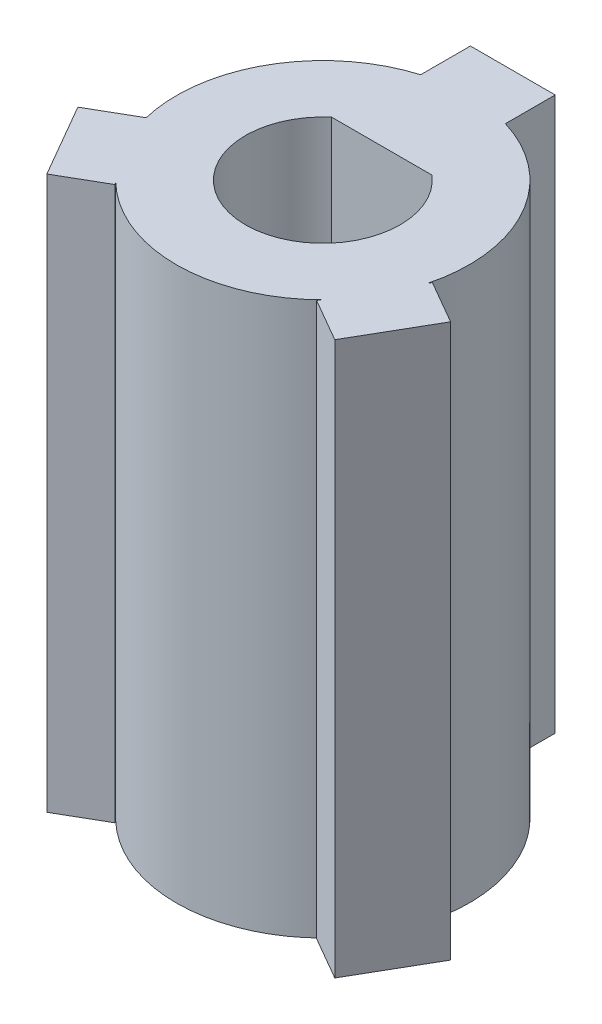
ISO-10303-21;
HEADER;
FILE_DESCRIPTION(('STEP AP214'),'2;1');
FILE_NAME('part.step','',(''),(''),'','','');
FILE_SCHEMA(('AUTOMOTIVE_DESIGN { 1 0 10303 214 1 1 1 1 }'));
ENDSEC;
DATA;
#1=APPLICATION_CONTEXT('core data for automotive mechanical design processes');
#2=APPLICATION_PROTOCOL_DEFINITION('international standard','automotive_design',2000,#1);
#3=PRODUCT_CONTEXT('',#1,'mechanical');
#4=PRODUCT('Part','Part','',(#3));
#5=PRODUCT_RELATED_PRODUCT_CATEGORY('part','',(#4));
#6=PRODUCT_DEFINITION_FORMATION('','',#4);
#7=PRODUCT_DEFINITION_CONTEXT('part definition',#1,'design');
#8=PRODUCT_DEFINITION('design','',#6,#7);
#9=PRODUCT_DEFINITION_SHAPE('','',#8);
#10=(LENGTH_UNIT() NAMED_UNIT(*) SI_UNIT(.MILLI.,.METRE.));
#11=(NAMED_UNIT(*) PLANE_ANGLE_UNIT() SI_UNIT($,.RADIAN.));
#12=(NAMED_UNIT(*) SI_UNIT($,.STERADIAN.) SOLID_ANGLE_UNIT());
#13=UNCERTAINTY_MEASURE_WITH_UNIT(LENGTH_MEASURE(1.E-05),#10,'distance_accuracy_value','');
#14=(GEOMETRIC_REPRESENTATION_CONTEXT(3) GLOBAL_UNCERTAINTY_ASSIGNED_CONTEXT((#13)) GLOBAL_UNIT_ASSIGNED_CONTEXT((#10,
#11,#12)) REPRESENTATION_CONTEXT('',''));
#15=CARTESIAN_POINT('',(0.,0.,0.));
#16=DIRECTION('',(0.,0.,1.));
#17=DIRECTION('',(1.,0.,0.));
#18=AXIS2_PLACEMENT_3D('',#15,#16,#17);
#19=CARTESIAN_POINT('',(0.,15.,0.));
#20=DIRECTION('',(0.,-1.,0.));
#21=DIRECTION('',(0.,0.,-1.));
#22=AXIS2_PLACEMENT_3D('',#19,#20,#21);
#23=CYLINDRICAL_SURFACE('',#22,3.975);
#24=CARTESIAN_POINT('',(0.,15.,0.));
#25=DIRECTION('',(0.,1.,0.));
#26=DIRECTION('',(0.,0.,1.));
#27=AXIS2_PLACEMENT_3D('',#24,#25,#26);
#28=CIRCLE('',#27,3.975);
#29=CARTESIAN_POINT('',(-2.75382417152025,15.,2.86654451079183));
#30=VERTEX_POINT('',#29);
#31=CARTESIAN_POINT('',(2.78842197507801,15.,2.8329009670128));
#32=VERTEX_POINT('',#31);
#33=EDGE_CURVE('E49',#30,#32,#28,.T.);
#34=ORIENTED_EDGE('',*,*,#33,.F.);
#35=DIRECTION('',(0.,-1.,0.));
#36=VECTOR('',#35,1.);
#37=CARTESIAN_POINT('',(-2.75382417152025,15.,2.86654451079183));
#38=LINE('',#37,#36);
#39=CARTESIAN_POINT('',(-2.75382417152025,0.,2.86654451079183));
#40=VERTEX_POINT('',#39);
#41=EDGE_CURVE('E219',#30,#40,#38,.T.);
#42=ORIENTED_EDGE('',*,*,#41,.T.);
#43=CARTESIAN_POINT('',(0.,0.,0.));
#44=DIRECTION('',(0.,1.,0.));
#45=DIRECTION('',(0.,0.,1.));
#46=AXIS2_PLACEMENT_3D('',#43,#44,#45);
#47=CIRCLE('',#46,3.975);
#48=CARTESIAN_POINT('',(2.78842197507801,0.,2.8329009670128));
#49=VERTEX_POINT('',#48);
#50=EDGE_CURVE('E342',#40,#49,#47,.T.);
#51=ORIENTED_EDGE('',*,*,#50,.T.);
#52=DIRECTION('',(0.,-1.,0.));
#53=VECTOR('',#52,1.);
#54=CARTESIAN_POINT('',(2.78842197507801,15.,2.8329009670128));
#55=LINE('',#54,#53);
#56=EDGE_CURVE('E266',#49,#32,#55,.F.);
#57=ORIENTED_EDGE('',*,*,#56,.T.);
#58=EDGE_LOOP('',(#34,#42,#51,#57));
#59=FACE_BOUND('',#58,.T.);
#60=ADVANCED_FACE('F39',(#59),#23,.T.);
#61=CARTESIAN_POINT('',(3.84757519137759,15.,0.998393783381934));
#62=VERTEX_POINT('',#61);
#63=CARTESIAN_POINT('',(1.15,15.,-3.80501314058178));
#64=VERTEX_POINT('',#63);
#65=EDGE_CURVE('E50',#62,#64,#28,.T.);
#66=ORIENTED_EDGE('',*,*,#65,.F.);
#67=DIRECTION('',(0.,-1.,0.));
#68=VECTOR('',#67,1.);
#69=CARTESIAN_POINT('',(3.84757519137759,15.,0.998393783381935));
#70=LINE('',#69,#68);
#71=CARTESIAN_POINT('',(3.84757519137759,0.,0.998393783381934));
#72=VERTEX_POINT('',#71);
#73=EDGE_CURVE('E269',#62,#72,#70,.T.);
#74=ORIENTED_EDGE('',*,*,#73,.T.);
#75=CARTESIAN_POINT('',(1.15,0.,-3.80501314058178));
#76=VERTEX_POINT('',#75);
#77=EDGE_CURVE('E327',#72,#76,#47,.T.);
#78=ORIENTED_EDGE('',*,*,#77,.T.);
#79=DIRECTION('',(0.,1.,0.));
#80=VECTOR('',#79,1.);
#81=CARTESIAN_POINT('',(1.15,-3.53419265992976,-3.80501314058178));
#82=LINE('',#81,#80);
#83=EDGE_CURVE('E302',#76,#64,#82,.T.);
#84=ORIENTED_EDGE('',*,*,#83,.T.);
#85=EDGE_LOOP('',(#66,#74,#78,#84));
#86=FACE_BOUND('',#85,.T.);
#87=ADVANCED_FACE('F404',(#86),#23,.T.);
#88=CARTESIAN_POINT('',(-1.15,0.,-3.80501314058178));
#89=VERTEX_POINT('',#88);
#90=CARTESIAN_POINT('',(-3.85941245318469,0.,0.95160943469626));
#91=VERTEX_POINT('',#90);
#92=EDGE_CURVE('E43',#89,#91,#47,.T.);
#93=ORIENTED_EDGE('',*,*,#92,.T.);
#94=DIRECTION('',(0.,-1.,0.));
#95=VECTOR('',#94,1.);
#96=CARTESIAN_POINT('',(-3.85941245318469,15.,0.951609434696261));
#97=LINE('',#96,#95);
#98=CARTESIAN_POINT('',(-3.85941245318469,15.,0.95160943469626));
#99=VERTEX_POINT('',#98);
#100=EDGE_CURVE('E64',#91,#99,#97,.F.);
#101=ORIENTED_EDGE('',*,*,#100,.T.);
#102=CARTESIAN_POINT('',(-1.15,15.,-3.80501314058178));
#103=VERTEX_POINT('',#102);
#104=EDGE_CURVE('E11',#103,#99,#28,.T.);
#105=ORIENTED_EDGE('',*,*,#104,.F.);
#106=DIRECTION('',(0.,1.,0.));
#107=VECTOR('',#106,1.);
#108=CARTESIAN_POINT('',(-1.15,-3.53419265992976,-3.80501314058178));
#109=LINE('',#108,#107);
#110=EDGE_CURVE('E296',#89,#103,#109,.T.);
#111=ORIENTED_EDGE('',*,*,#110,.F.);
#112=EDGE_LOOP('',(#93,#101,#105,#111));
#113=FACE_BOUND('',#112,.T.);
#114=ADVANCED_FACE('F41',(#113),#23,.T.);
#115=CARTESIAN_POINT('',(0.,15.,0.));
#116=DIRECTION('',(0.,1.,0.));
#117=DIRECTION('',(0.,0.,1.));
#118=AXIS2_PLACEMENT_3D('',#115,#116,#117);
#119=PLANE('',#118);
#120=ORIENTED_EDGE('',*,*,#104,.T.);
#121=DIRECTION('',(-0.5,0.,-0.866025403784438));
#122=VECTOR('',#121,1.);
#123=CARTESIAN_POINT('',(-2.72023804147724,15.,2.92471739445595));
#124=LINE('',#123,#122);
#125=CARTESIAN_POINT('',(-3.87023804147724,15.,0.932858965751743));
#126=VERTEX_POINT('',#125);
#127=EDGE_CURVE('E166',#99,#126,#124,.T.);
#128=ORIENTED_EDGE('',*,*,#127,.T.);
#129=DIRECTION('',(-0.866025403784438,0.,0.5));
#130=VECTOR('',#129,1.);
#131=CARTESIAN_POINT('',(-3.87023804147724,15.,0.932858965751743));
#132=LINE('',#131,#130);
#133=CARTESIAN_POINT('',(-5.03937233658623,15.,1.60785896575174));
#134=VERTEX_POINT('',#133);
#135=EDGE_CURVE('E172',#126,#134,#132,.T.);
#136=ORIENTED_EDGE('',*,*,#135,.T.);
#137=DIRECTION('',(0.500000000000001,0.,0.866025403784438));
#138=VECTOR('',#137,1.);
#139=CARTESIAN_POINT('',(-5.03937233658623,15.,1.60785896575174));
#140=LINE('',#139,#138);
#141=CARTESIAN_POINT('',(-3.88937233658623,15.,3.59971739445595));
#142=VERTEX_POINT('',#141);
#143=EDGE_CURVE('E194',#134,#142,#140,.T.);
#144=ORIENTED_EDGE('',*,*,#143,.T.);
#145=DIRECTION('',(0.866025403784438,0.,-0.5));
#146=VECTOR('',#145,1.);
#147=CARTESIAN_POINT('',(-3.88937233658623,15.,3.59971739445595));
#148=LINE('',#147,#146);
#149=CARTESIAN_POINT('',(-2.72023804147724,15.,2.92471739445595));
#150=VERTEX_POINT('',#149);
#151=EDGE_CURVE('E188',#142,#150,#148,.T.);
#152=ORIENTED_EDGE('',*,*,#151,.T.);
#153=EDGE_CURVE('E176',#150,#30,#124,.T.);
#154=ORIENTED_EDGE('',*,*,#153,.T.);
#155=ORIENTED_EDGE('',*,*,#33,.T.);
#156=DIRECTION('',(-0.5,0.,0.866025403784439));
#157=VECTOR('',#156,1.);
#158=CARTESIAN_POINT('',(3.8929985832279,15.,0.919718160845097));
#159=LINE('',#158,#157);
#160=CARTESIAN_POINT('',(2.7429985832279,15.,2.91157658954931));
#161=VERTEX_POINT('',#160);
#162=EDGE_CURVE('E222',#32,#161,#159,.T.);
#163=ORIENTED_EDGE('',*,*,#162,.T.);
#164=DIRECTION('',(0.866025403784439,0.,0.499999999999999));
#165=VECTOR('',#164,1.);
#166=CARTESIAN_POINT('',(2.7429985832279,15.,2.91157658954931));
#167=LINE('',#166,#165);
#168=CARTESIAN_POINT('',(3.91213287833689,15.,3.58657658954931));
#169=VERTEX_POINT('',#168);
#170=EDGE_CURVE('E240',#161,#169,#167,.T.);
#171=ORIENTED_EDGE('',*,*,#170,.T.);
#172=DIRECTION('',(0.499999999999999,0.,-0.866025403784439));
#173=VECTOR('',#172,1.);
#174=CARTESIAN_POINT('',(3.91213287833689,15.,3.58657658954931));
#175=LINE('',#174,#173);
#176=CARTESIAN_POINT('',(5.06213287833689,15.,1.5947181608451));
#177=VERTEX_POINT('',#176);
#178=EDGE_CURVE('E244',#169,#177,#175,.T.);
#179=ORIENTED_EDGE('',*,*,#178,.T.);
#180=DIRECTION('',(-0.866025403784439,0.,-0.5));
#181=VECTOR('',#180,1.);
#182=CARTESIAN_POINT('',(5.06213287833689,15.,1.5947181608451));
#183=LINE('',#182,#181);
#184=CARTESIAN_POINT('',(3.8929985832279,15.,0.919718160845097));
#185=VERTEX_POINT('',#184);
#186=EDGE_CURVE('E248',#177,#185,#183,.T.);
#187=ORIENTED_EDGE('',*,*,#186,.T.);
#188=EDGE_CURVE('E236',#185,#62,#159,.T.);
#189=ORIENTED_EDGE('',*,*,#188,.T.);
#190=ORIENTED_EDGE('',*,*,#65,.T.);
#191=DIRECTION('',(0.,0.,-1.));
#192=VECTOR('',#191,1.);
#193=CARTESIAN_POINT('',(1.15,15.,-3.80501314058178));
#194=LINE('',#193,#192);
#195=CARTESIAN_POINT('',(1.15,15.,-5.15501314058178));
#196=VERTEX_POINT('',#195);
#197=EDGE_CURVE('E288',#64,#196,#194,.T.);
#198=ORIENTED_EDGE('',*,*,#197,.T.);
#199=DIRECTION('',(-1.,0.,0.));
#200=VECTOR('',#199,1.);
#201=CARTESIAN_POINT('',(1.15,15.,-5.15501314058178));
#202=LINE('',#201,#200);
#203=CARTESIAN_POINT('',(-1.15,15.,-5.15501314058178));
#204=VERTEX_POINT('',#203);
#205=EDGE_CURVE('E292',#196,#204,#202,.T.);
#206=ORIENTED_EDGE('',*,*,#205,.T.);
#207=DIRECTION('',(0.,0.,1.));
#208=VECTOR('',#207,1.);
#209=CARTESIAN_POINT('',(-1.15,15.,-5.15501314058178));
#210=LINE('',#209,#208);
#211=EDGE_CURVE('E273',#204,#103,#210,.T.);
#212=ORIENTED_EDGE('',*,*,#211,.T.);
#213=EDGE_LOOP('',(#120,#128,#136,#144,#152,#154,#155,#163,#171,#179,#187,#189,#190,#198,#206,#212));
#214=FACE_BOUND('',#213,.T.);
#215=CARTESIAN_POINT('',(0.,15.,0.));
#216=DIRECTION('',(0.,1.,0.));
#217=DIRECTION('',(0.,0.,1.));
#218=AXIS2_PLACEMENT_3D('',#215,#216,#217);
#219=CIRCLE('',#218,2.1);
#220=CARTESIAN_POINT('',(-1.36014705087354,15.,-1.6));
#221=VERTEX_POINT('',#220);
#222=CARTESIAN_POINT('',(1.36014705087354,15.,-1.6));
#223=VERTEX_POINT('',#222);
#224=EDGE_CURVE('E285',#221,#223,#219,.T.);
#225=ORIENTED_EDGE('',*,*,#224,.F.);
#226=DIRECTION('',(-1.,0.,0.));
#227=VECTOR('',#226,1.);
#228=CARTESIAN_POINT('',(-1.36014705087354,15.,-1.6));
#229=LINE('',#228,#227);
#230=EDGE_CURVE('E314',#223,#221,#229,.T.);
#231=ORIENTED_EDGE('',*,*,#230,.F.);
#232=EDGE_LOOP('',(#225,#231));
#233=FACE_BOUND('',#232,.T.);
#234=ADVANCED_FACE('F168',(#214,#233),#119,.T.);
#235=CARTESIAN_POINT('',(0.,0.,0.));
#236=DIRECTION('',(0.,1.,0.));
#237=DIRECTION('',(0.,0.,1.));
#238=AXIS2_PLACEMENT_3D('',#235,#236,#237);
#239=PLANE('',#238);
#240=DIRECTION('',(-1.,0.,0.));
#241=VECTOR('',#240,1.);
#242=CARTESIAN_POINT('',(-1.36014705087354,0.,-1.6));
#243=LINE('',#242,#241);
#244=CARTESIAN_POINT('',(1.36014705087354,0.,-1.6));
#245=VERTEX_POINT('',#244);
#246=CARTESIAN_POINT('',(-1.36014705087354,0.,-1.6));
#247=VERTEX_POINT('',#246);
#248=EDGE_CURVE('E313',#245,#247,#243,.T.);
#249=ORIENTED_EDGE('',*,*,#248,.T.);
#250=CARTESIAN_POINT('',(0.,0.,0.));
#251=DIRECTION('',(0.,1.,0.));
#252=DIRECTION('',(0.,0.,1.));
#253=AXIS2_PLACEMENT_3D('',#250,#251,#252);
#254=CIRCLE('',#253,2.1);
#255=EDGE_CURVE('E309',#247,#245,#254,.T.);
#256=ORIENTED_EDGE('',*,*,#255,.T.);
#257=EDGE_LOOP('',(#249,#256));
#258=FACE_BOUND('',#257,.T.);
#259=ORIENTED_EDGE('',*,*,#50,.F.);
#260=DIRECTION('',(0.5,0.,0.866025403784438));
#261=VECTOR('',#260,1.);
#262=CARTESIAN_POINT('',(-2.72023804147724,0.,2.92471739445595));
#263=LINE('',#262,#261);
#264=CARTESIAN_POINT('',(-2.72023804147724,0.,2.92471739445595));
#265=VERTEX_POINT('',#264);
#266=EDGE_CURVE('E344',#40,#265,#263,.T.);
#267=ORIENTED_EDGE('',*,*,#266,.T.);
#268=DIRECTION('',(-0.866025403784439,0.,0.5));
#269=VECTOR('',#268,1.);
#270=CARTESIAN_POINT('',(-3.88937233658623,0.,3.59971739445595));
#271=LINE('',#270,#269);
#272=CARTESIAN_POINT('',(-3.88937233658623,0.,3.59971739445595));
#273=VERTEX_POINT('',#272);
#274=EDGE_CURVE('E354',#265,#273,#271,.T.);
#275=ORIENTED_EDGE('',*,*,#274,.T.);
#276=DIRECTION('',(-0.500000000000001,0.,-0.866025403784438));
#277=VECTOR('',#276,1.);
#278=CARTESIAN_POINT('',(-5.03937233658623,0.,1.60785896575174));
#279=LINE('',#278,#277);
#280=CARTESIAN_POINT('',(-5.03937233658623,0.,1.60785896575174));
#281=VERTEX_POINT('',#280);
#282=EDGE_CURVE('E208',#273,#281,#279,.T.);
#283=ORIENTED_EDGE('',*,*,#282,.T.);
#284=DIRECTION('',(0.866025403784439,0.,-0.5));
#285=VECTOR('',#284,1.);
#286=CARTESIAN_POINT('',(-3.87023804147724,0.,0.932858965751743));
#287=LINE('',#286,#285);
#288=CARTESIAN_POINT('',(-3.87023804147724,0.,0.932858965751743));
#289=VERTEX_POINT('',#288);
#290=EDGE_CURVE('E214',#281,#289,#287,.T.);
#291=ORIENTED_EDGE('',*,*,#290,.T.);
#292=EDGE_CURVE('E183',#289,#91,#263,.T.);
#293=ORIENTED_EDGE('',*,*,#292,.T.);
#294=ORIENTED_EDGE('',*,*,#92,.F.);
#295=DIRECTION('',(0.,0.,-1.));
#296=VECTOR('',#295,1.);
#297=CARTESIAN_POINT('',(-1.15,0.,-5.15501314058178));
#298=LINE('',#297,#296);
#299=CARTESIAN_POINT('',(-1.15,0.,-5.15501314058178));
#300=VERTEX_POINT('',#299);
#301=EDGE_CURVE('E282',#89,#300,#298,.T.);
#302=ORIENTED_EDGE('',*,*,#301,.T.);
#303=DIRECTION('',(1.,0.,0.));
#304=VECTOR('',#303,1.);
#305=CARTESIAN_POINT('',(1.15,0.,-5.15501314058178));
#306=LINE('',#305,#304);
#307=CARTESIAN_POINT('',(1.15,0.,-5.15501314058178));
#308=VERTEX_POINT('',#307);
#309=EDGE_CURVE('E278',#300,#308,#306,.T.);
#310=ORIENTED_EDGE('',*,*,#309,.T.);
#311=DIRECTION('',(0.,0.,1.));
#312=VECTOR('',#311,1.);
#313=CARTESIAN_POINT('',(1.15,0.,-3.80501314058178));
#314=LINE('',#313,#312);
#315=EDGE_CURVE('E274',#308,#76,#314,.T.);
#316=ORIENTED_EDGE('',*,*,#315,.T.);
#317=ORIENTED_EDGE('',*,*,#77,.F.);
#318=DIRECTION('',(0.5,0.,-0.866025403784439));
#319=VECTOR('',#318,1.);
#320=CARTESIAN_POINT('',(3.8929985832279,0.,0.919718160845097));
#321=LINE('',#320,#319);
#322=CARTESIAN_POINT('',(3.8929985832279,0.,0.919718160845097));
#323=VERTEX_POINT('',#322);
#324=EDGE_CURVE('E230',#72,#323,#321,.T.);
#325=ORIENTED_EDGE('',*,*,#324,.T.);
#326=DIRECTION('',(0.866025403784439,0.,0.5));
#327=VECTOR('',#326,1.);
#328=CARTESIAN_POINT('',(5.06213287833689,0.,1.5947181608451));
#329=LINE('',#328,#327);
#330=CARTESIAN_POINT('',(5.06213287833689,0.,1.5947181608451));
#331=VERTEX_POINT('',#330);
#332=EDGE_CURVE('E226',#323,#331,#329,.T.);
#333=ORIENTED_EDGE('',*,*,#332,.T.);
#334=DIRECTION('',(-0.499999999999999,0.,0.866025403784439));
#335=VECTOR('',#334,1.);
#336=CARTESIAN_POINT('',(3.91213287833689,0.,3.58657658954931));
#337=LINE('',#336,#335);
#338=CARTESIAN_POINT('',(3.91213287833689,0.,3.58657658954931));
#339=VERTEX_POINT('',#338);
#340=EDGE_CURVE('E223',#331,#339,#337,.T.);
#341=ORIENTED_EDGE('',*,*,#340,.T.);
#342=DIRECTION('',(-0.866025403784439,0.,-0.499999999999999));
#343=VECTOR('',#342,1.);
#344=CARTESIAN_POINT('',(2.7429985832279,0.,2.91157658954931));
#345=LINE('',#344,#343);
#346=CARTESIAN_POINT('',(2.7429985832279,0.,2.91157658954931));
#347=VERTEX_POINT('',#346);
#348=EDGE_CURVE('E235',#339,#347,#345,.T.);
#349=ORIENTED_EDGE('',*,*,#348,.T.);
#350=EDGE_CURVE('E231',#347,#49,#321,.T.);
#351=ORIENTED_EDGE('',*,*,#350,.T.);
#352=EDGE_LOOP('',(#259,#267,#275,#283,#291,#293,#294,#302,#310,#316,#317,#325,#333,#341,#349,#351));
#353=FACE_BOUND('',#352,.T.);
#354=ADVANCED_FACE('F339',(#258,#353),#239,.F.);
#355=CARTESIAN_POINT('',(0.,0.,0.));
#356=DIRECTION('',(0.,1.,0.));
#357=DIRECTION('',(0.,0.,1.));
#358=AXIS2_PLACEMENT_3D('',#355,#356,#357);
#359=CYLINDRICAL_SURFACE('',#358,2.1);
#360=ORIENTED_EDGE('',*,*,#224,.T.);
#361=DIRECTION('',(0.,1.,0.));
#362=VECTOR('',#361,1.);
#363=CARTESIAN_POINT('',(1.36014705087354,0.,-1.6));
#364=LINE('',#363,#362);
#365=EDGE_CURVE('E318',#245,#223,#364,.T.);
#366=ORIENTED_EDGE('',*,*,#365,.F.);
#367=ORIENTED_EDGE('',*,*,#255,.F.);
#368=DIRECTION('',(0.,1.,0.));
#369=VECTOR('',#368,1.);
#370=CARTESIAN_POINT('',(-1.36014705087354,0.,-1.6));
#371=LINE('',#370,#369);
#372=EDGE_CURVE('E324',#247,#221,#371,.T.);
#373=ORIENTED_EDGE('',*,*,#372,.T.);
#374=EDGE_LOOP('',(#360,#366,#367,#373));
#375=FACE_BOUND('',#374,.T.);
#376=ADVANCED_FACE('F337',(#375),#359,.F.);
#377=CARTESIAN_POINT('',(-1.36014705087354,0.,-1.6));
#378=DIRECTION('',(0.,0.,-1.));
#379=DIRECTION('',(-1.,0.,0.));
#380=AXIS2_PLACEMENT_3D('',#377,#378,#379);
#381=PLANE('',#380);
#382=ORIENTED_EDGE('',*,*,#230,.T.);
#383=ORIENTED_EDGE('',*,*,#372,.F.);
#384=ORIENTED_EDGE('',*,*,#248,.F.);
#385=ORIENTED_EDGE('',*,*,#365,.T.);
#386=EDGE_LOOP('',(#382,#383,#384,#385));
#387=FACE_BOUND('',#386,.T.);
#388=ADVANCED_FACE('F333',(#387),#381,.F.);
#389=CARTESIAN_POINT('',(-1.15,-3.53419265992976,-5.15501314058178));
#390=DIRECTION('',(-1.,0.,0.));
#391=DIRECTION('',(0.,0.,1.));
#392=AXIS2_PLACEMENT_3D('',#389,#390,#391);
#393=PLANE('',#392);
#394=ORIENTED_EDGE('',*,*,#301,.F.);
#395=ORIENTED_EDGE('',*,*,#110,.T.);
#396=ORIENTED_EDGE('',*,*,#211,.F.);
#397=DIRECTION('',(0.,1.,0.));
#398=VECTOR('',#397,1.);
#399=CARTESIAN_POINT('',(-1.15,-3.53419265992976,-5.15501314058178));
#400=LINE('',#399,#398);
#401=EDGE_CURVE('E279',#300,#204,#400,.T.);
#402=ORIENTED_EDGE('',*,*,#401,.F.);
#403=EDGE_LOOP('',(#394,#395,#396,#402));
#404=FACE_BOUND('',#403,.T.);
#405=ADVANCED_FACE('F432',(#404),#393,.T.);
#406=CARTESIAN_POINT('',(1.15,-3.53419265992976,-5.15501314058178));
#407=DIRECTION('',(0.,0.,-1.));
#408=DIRECTION('',(-1.,0.,0.));
#409=AXIS2_PLACEMENT_3D('',#406,#407,#408);
#410=PLANE('',#409);
#411=ORIENTED_EDGE('',*,*,#309,.F.);
#412=ORIENTED_EDGE('',*,*,#401,.T.);
#413=ORIENTED_EDGE('',*,*,#205,.F.);
#414=DIRECTION('',(0.,1.,0.));
#415=VECTOR('',#414,1.);
#416=CARTESIAN_POINT('',(1.15,-3.53419265992976,-5.15501314058178));
#417=LINE('',#416,#415);
#418=EDGE_CURVE('E299',#308,#196,#417,.T.);
#419=ORIENTED_EDGE('',*,*,#418,.F.);
#420=EDGE_LOOP('',(#411,#412,#413,#419));
#421=FACE_BOUND('',#420,.T.);
#422=ADVANCED_FACE('F428',(#421),#410,.T.);
#423=CARTESIAN_POINT('',(1.15,-3.53419265992976,-3.80501314058178));
#424=DIRECTION('',(1.,0.,0.));
#425=DIRECTION('',(0.,0.,-1.));
#426=AXIS2_PLACEMENT_3D('',#423,#424,#425);
#427=PLANE('',#426);
#428=ORIENTED_EDGE('',*,*,#315,.F.);
#429=ORIENTED_EDGE('',*,*,#418,.T.);
#430=ORIENTED_EDGE('',*,*,#197,.F.);
#431=ORIENTED_EDGE('',*,*,#83,.F.);
#432=EDGE_LOOP('',(#428,#429,#430,#431));
#433=FACE_BOUND('',#432,.T.);
#434=ADVANCED_FACE('F425',(#433),#427,.T.);
#435=CARTESIAN_POINT('',(3.8929985832279,-3.53419265992976,0.919718160845097));
#436=DIRECTION('',(-0.866025403784439,0.,-0.5));
#437=DIRECTION('',(-0.5,0.,0.866025403784439));
#438=AXIS2_PLACEMENT_3D('',#435,#436,#437);
#439=PLANE('',#438);
#440=ORIENTED_EDGE('',*,*,#73,.F.);
#441=ORIENTED_EDGE('',*,*,#188,.F.);
#442=DIRECTION('',(0.,1.,0.));
#443=VECTOR('',#442,1.);
#444=CARTESIAN_POINT('',(3.8929985832279,-3.53419265992976,0.919718160845097));
#445=LINE('',#444,#443);
#446=EDGE_CURVE('E227',#323,#185,#445,.T.);
#447=ORIENTED_EDGE('',*,*,#446,.F.);
#448=ORIENTED_EDGE('',*,*,#324,.F.);
#449=EDGE_LOOP('',(#440,#441,#447,#448));
#450=FACE_BOUND('',#449,.T.);
#451=ADVANCED_FACE('F386',(#450),#439,.T.);
#452=ORIENTED_EDGE('',*,*,#56,.F.);
#453=ORIENTED_EDGE('',*,*,#350,.F.);
#454=DIRECTION('',(0.,1.,0.));
#455=VECTOR('',#454,1.);
#456=CARTESIAN_POINT('',(2.7429985832279,-3.53419265992976,2.91157658954931));
#457=LINE('',#456,#455);
#458=EDGE_CURVE('E252',#347,#161,#457,.T.);
#459=ORIENTED_EDGE('',*,*,#458,.T.);
#460=ORIENTED_EDGE('',*,*,#162,.F.);
#461=EDGE_LOOP('',(#452,#453,#459,#460));
#462=FACE_BOUND('',#461,.T.);
#463=ADVANCED_FACE('F370',(#462),#439,.T.);
#464=CARTESIAN_POINT('',(5.06213287833689,-3.53419265992976,1.5947181608451));
#465=DIRECTION('',(0.5,0.,-0.866025403784439));
#466=DIRECTION('',(-0.866025403784439,0.,-0.5));
#467=AXIS2_PLACEMENT_3D('',#464,#465,#466);
#468=PLANE('',#467);
#469=ORIENTED_EDGE('',*,*,#332,.F.);
#470=ORIENTED_EDGE('',*,*,#446,.T.);
#471=ORIENTED_EDGE('',*,*,#186,.F.);
#472=DIRECTION('',(0.,1.,0.));
#473=VECTOR('',#472,1.);
#474=CARTESIAN_POINT('',(5.06213287833689,-3.53419265992976,1.5947181608451));
#475=LINE('',#474,#473);
#476=EDGE_CURVE('E255',#331,#177,#475,.T.);
#477=ORIENTED_EDGE('',*,*,#476,.F.);
#478=EDGE_LOOP('',(#469,#470,#471,#477));
#479=FACE_BOUND('',#478,.T.);
#480=ADVANCED_FACE('F383',(#479),#468,.T.);
#481=CARTESIAN_POINT('',(3.91213287833689,-3.53419265992976,3.58657658954931));
#482=DIRECTION('',(0.866025403784439,0.,0.499999999999999));
#483=DIRECTION('',(0.499999999999999,0.,-0.866025403784439));
#484=AXIS2_PLACEMENT_3D('',#481,#482,#483);
#485=PLANE('',#484);
#486=ORIENTED_EDGE('',*,*,#340,.F.);
#487=ORIENTED_EDGE('',*,*,#476,.T.);
#488=ORIENTED_EDGE('',*,*,#178,.F.);
#489=DIRECTION('',(0.,1.,0.));
#490=VECTOR('',#489,1.);
#491=CARTESIAN_POINT('',(3.91213287833689,-3.53419265992976,3.58657658954931));
#492=LINE('',#491,#490);
#493=EDGE_CURVE('E258',#339,#169,#492,.T.);
#494=ORIENTED_EDGE('',*,*,#493,.F.);
#495=EDGE_LOOP('',(#486,#487,#488,#494));
#496=FACE_BOUND('',#495,.T.);
#497=ADVANCED_FACE('F390',(#496),#485,.T.);
#498=CARTESIAN_POINT('',(2.7429985832279,-3.53419265992976,2.91157658954931));
#499=DIRECTION('',(-0.499999999999999,0.,0.866025403784439));
#500=DIRECTION('',(0.866025403784439,0.,0.499999999999999));
#501=AXIS2_PLACEMENT_3D('',#498,#499,#500);
#502=PLANE('',#501);
#503=ORIENTED_EDGE('',*,*,#348,.F.);
#504=ORIENTED_EDGE('',*,*,#493,.T.);
#505=ORIENTED_EDGE('',*,*,#170,.F.);
#506=ORIENTED_EDGE('',*,*,#458,.F.);
#507=EDGE_LOOP('',(#503,#504,#505,#506));
#508=FACE_BOUND('',#507,.T.);
#509=ADVANCED_FACE('F393',(#508),#502,.T.);
#510=CARTESIAN_POINT('',(-2.72023804147724,-3.53419265992976,2.92471739445595));
#511=DIRECTION('',(0.866025403784438,0.,-0.5));
#512=DIRECTION('',(-0.5,0.,-0.866025403784438));
#513=AXIS2_PLACEMENT_3D('',#510,#511,#512);
#514=PLANE('',#513);
#515=ORIENTED_EDGE('',*,*,#41,.F.);
#516=ORIENTED_EDGE('',*,*,#153,.F.);
#517=DIRECTION('',(0.,1.,0.));
#518=VECTOR('',#517,1.);
#519=CARTESIAN_POINT('',(-2.72023804147724,-3.53419265992976,2.92471739445595));
#520=LINE('',#519,#518);
#521=EDGE_CURVE('E205',#265,#150,#520,.T.);
#522=ORIENTED_EDGE('',*,*,#521,.F.);
#523=ORIENTED_EDGE('',*,*,#266,.F.);
#524=EDGE_LOOP('',(#515,#516,#522,#523));
#525=FACE_BOUND('',#524,.T.);
#526=ADVANCED_FACE('F352',(#525),#514,.T.);
#527=ORIENTED_EDGE('',*,*,#100,.F.);
#528=ORIENTED_EDGE('',*,*,#292,.F.);
#529=DIRECTION('',(0.,1.,0.));
#530=VECTOR('',#529,1.);
#531=CARTESIAN_POINT('',(-3.87023804147724,-3.53419265992976,0.932858965751743));
#532=LINE('',#531,#530);
#533=EDGE_CURVE('E180',#289,#126,#532,.T.);
#534=ORIENTED_EDGE('',*,*,#533,.T.);
#535=ORIENTED_EDGE('',*,*,#127,.F.);
#536=EDGE_LOOP('',(#527,#528,#534,#535));
#537=FACE_BOUND('',#536,.T.);
#538=ADVANCED_FACE('F181',(#537),#514,.T.);
#539=CARTESIAN_POINT('',(-3.88937233658623,-3.53419265992976,3.59971739445595));
#540=DIRECTION('',(0.5,0.,0.866025403784438));
#541=DIRECTION('',(0.866025403784439,0.,-0.5));
#542=AXIS2_PLACEMENT_3D('',#539,#540,#541);
#543=PLANE('',#542);
#544=ORIENTED_EDGE('',*,*,#274,.F.);
#545=ORIENTED_EDGE('',*,*,#521,.T.);
#546=ORIENTED_EDGE('',*,*,#151,.F.);
#547=DIRECTION('',(0.,1.,0.));
#548=VECTOR('',#547,1.);
#549=CARTESIAN_POINT('',(-3.88937233658623,-3.53419265992976,3.59971739445595));
#550=LINE('',#549,#548);
#551=EDGE_CURVE('E209',#273,#142,#550,.T.);
#552=ORIENTED_EDGE('',*,*,#551,.F.);
#553=EDGE_LOOP('',(#544,#545,#546,#552));
#554=FACE_BOUND('',#553,.T.);
#555=ADVANCED_FACE('F366',(#554),#543,.T.);
#556=CARTESIAN_POINT('',(-5.03937233658623,-3.53419265992976,1.60785896575174));
#557=DIRECTION('',(-0.866025403784438,0.,0.500000000000001));
#558=DIRECTION('',(0.500000000000001,0.,0.866025403784438));
#559=AXIS2_PLACEMENT_3D('',#556,#557,#558);
#560=PLANE('',#559);
#561=ORIENTED_EDGE('',*,*,#282,.F.);
#562=ORIENTED_EDGE('',*,*,#551,.T.);
#563=ORIENTED_EDGE('',*,*,#143,.F.);
#564=DIRECTION('',(0.,1.,0.));
#565=VECTOR('',#564,1.);
#566=CARTESIAN_POINT('',(-5.03937233658623,-3.53419265992976,1.60785896575174));
#567=LINE('',#566,#565);
#568=EDGE_CURVE('E187',#281,#134,#567,.T.);
#569=ORIENTED_EDGE('',*,*,#568,.F.);
#570=EDGE_LOOP('',(#561,#562,#563,#569));
#571=FACE_BOUND('',#570,.T.);
#572=ADVANCED_FACE('F363',(#571),#560,.T.);
#573=CARTESIAN_POINT('',(-3.87023804147724,-3.53419265992976,0.932858965751743));
#574=DIRECTION('',(-0.5,0.,-0.866025403784438));
#575=DIRECTION('',(-0.866025403784439,0.,0.5));
#576=AXIS2_PLACEMENT_3D('',#573,#574,#575);
#577=PLANE('',#576);
#578=ORIENTED_EDGE('',*,*,#290,.F.);
#579=ORIENTED_EDGE('',*,*,#568,.T.);
#580=ORIENTED_EDGE('',*,*,#135,.F.);
#581=ORIENTED_EDGE('',*,*,#533,.F.);
#582=EDGE_LOOP('',(#578,#579,#580,#581));
#583=FACE_BOUND('',#582,.T.);
#584=ADVANCED_FACE('F190',(#583),#577,.T.);
#585=CLOSED_SHELL('',(#60,#87,#114,#234,#354,#376,#388,#405,#422,#434,#451,#463,#480,#497,#509,
#526,#538,#555,#572,#584));
#586=MANIFOLD_SOLID_BREP('B2',#585);
#587=ADVANCED_BREP_SHAPE_REPRESENTATION('',(#18,#586),#14);
#588=SHAPE_DEFINITION_REPRESENTATION(#9,#587);
ENDSEC;
END-ISO-10303-21;
